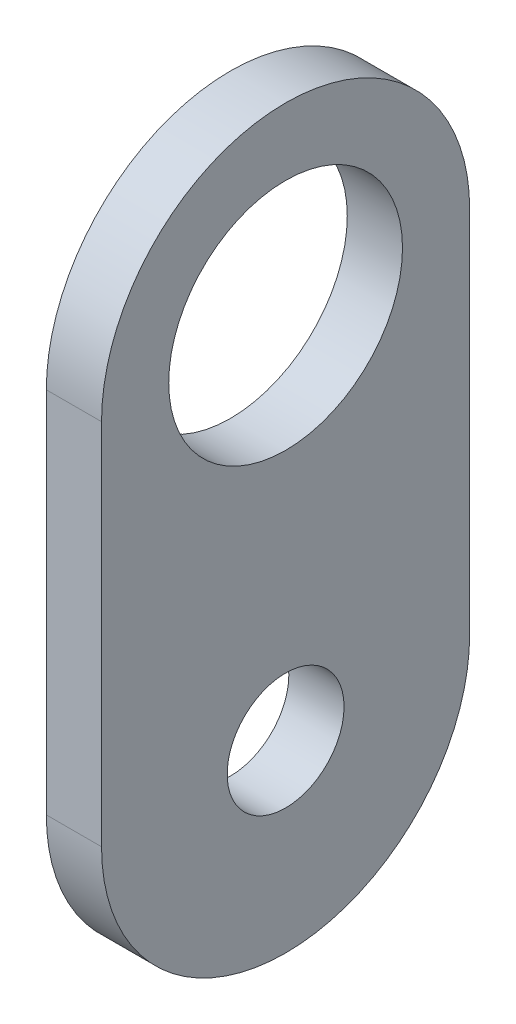
ISO-10303-21;
HEADER;
FILE_DESCRIPTION(('STEP AP214'),'2;1');
FILE_NAME('part.step','',(''),(''),'','','');
FILE_SCHEMA(('AUTOMOTIVE_DESIGN { 1 0 10303 214 1 1 1 1 }'));
ENDSEC;
DATA;
#1=APPLICATION_CONTEXT('core data for automotive mechanical design processes');
#2=APPLICATION_PROTOCOL_DEFINITION('international standard','automotive_design',2000,#1);
#3=PRODUCT_CONTEXT('',#1,'mechanical');
#4=PRODUCT('Part','Part','',(#3));
#5=PRODUCT_RELATED_PRODUCT_CATEGORY('part','',(#4));
#6=PRODUCT_DEFINITION_FORMATION('','',#4);
#7=PRODUCT_DEFINITION_CONTEXT('part definition',#1,'design');
#8=PRODUCT_DEFINITION('design','',#6,#7);
#9=PRODUCT_DEFINITION_SHAPE('','',#8);
#10=(LENGTH_UNIT() NAMED_UNIT(*) SI_UNIT(.MILLI.,.METRE.));
#11=(NAMED_UNIT(*) PLANE_ANGLE_UNIT() SI_UNIT($,.RADIAN.));
#12=(NAMED_UNIT(*) SI_UNIT($,.STERADIAN.) SOLID_ANGLE_UNIT());
#13=UNCERTAINTY_MEASURE_WITH_UNIT(LENGTH_MEASURE(1.E-05),#10,'distance_accuracy_value','');
#14=(GEOMETRIC_REPRESENTATION_CONTEXT(3) GLOBAL_UNCERTAINTY_ASSIGNED_CONTEXT((#13)) GLOBAL_UNIT_ASSIGNED_CONTEXT((#10,
#11,#12)) REPRESENTATION_CONTEXT('',''));
#15=CARTESIAN_POINT('',(0.,0.,0.));
#16=DIRECTION('',(0.,0.,1.));
#17=DIRECTION('',(1.,0.,0.));
#18=AXIS2_PLACEMENT_3D('',#15,#16,#17);
#19=CARTESIAN_POINT('',(0.,9.99999999999999,0.));
#20=DIRECTION('',(-1.,0.,0.));
#21=DIRECTION('',(0.,0.,1.));
#22=AXIS2_PLACEMENT_3D('',#19,#20,#21);
#23=CYLINDRICAL_SURFACE('',#22,10.);
#24=DIRECTION('',(1.,0.,0.));
#25=VECTOR('',#24,1.);
#26=CARTESIAN_POINT('',(0.,9.99999999999999,-10.));
#27=LINE('',#26,#25);
#28=CARTESIAN_POINT('',(0.,9.99999999999999,-10.));
#29=VERTEX_POINT('',#28);
#30=CARTESIAN_POINT('',(3.,9.99999999999999,-10.));
#31=VERTEX_POINT('',#30);
#32=EDGE_CURVE('E92',#29,#31,#27,.T.);
#33=ORIENTED_EDGE('',*,*,#32,.F.);
#34=CARTESIAN_POINT('',(0.,9.99999999999999,0.));
#35=DIRECTION('',(-1.,0.,0.));
#36=DIRECTION('',(0.,0.,1.));
#37=AXIS2_PLACEMENT_3D('',#34,#35,#36);
#38=CIRCLE('',#37,10.);
#39=CARTESIAN_POINT('',(0.,9.99999999999999,10.));
#40=VERTEX_POINT('',#39);
#41=EDGE_CURVE('E49',#40,#29,#38,.T.);
#42=ORIENTED_EDGE('',*,*,#41,.F.);
#43=DIRECTION('',(-1.,0.,0.));
#44=VECTOR('',#43,1.);
#45=CARTESIAN_POINT('',(3.,9.99999999999999,10.));
#46=LINE('',#45,#44);
#47=CARTESIAN_POINT('',(3.,9.99999999999999,10.));
#48=VERTEX_POINT('',#47);
#49=EDGE_CURVE('E130',#48,#40,#46,.T.);
#50=ORIENTED_EDGE('',*,*,#49,.F.);
#51=CARTESIAN_POINT('',(3.,9.99999999999999,0.));
#52=DIRECTION('',(-1.,0.,0.));
#53=DIRECTION('',(0.,0.,1.));
#54=AXIS2_PLACEMENT_3D('',#51,#52,#53);
#55=CIRCLE('',#54,10.);
#56=EDGE_CURVE('E11',#31,#48,#55,.F.);
#57=ORIENTED_EDGE('',*,*,#56,.F.);
#58=EDGE_LOOP('',(#33,#42,#50,#57));
#59=FACE_BOUND('',#58,.T.);
#60=ADVANCED_FACE('F40',(#59),#23,.T.);
#61=CARTESIAN_POINT('',(3.,-10.,0.));
#62=DIRECTION('',(-1.,0.,0.));
#63=DIRECTION('',(0.,0.,1.));
#64=AXIS2_PLACEMENT_3D('',#61,#62,#63);
#65=CYLINDRICAL_SURFACE('',#64,10.);
#66=DIRECTION('',(-1.,0.,0.));
#67=VECTOR('',#66,1.);
#68=CARTESIAN_POINT('',(3.,-10.,-10.));
#69=LINE('',#68,#67);
#70=CARTESIAN_POINT('',(3.,-10.,-10.));
#71=VERTEX_POINT('',#70);
#72=CARTESIAN_POINT('',(0.,-10.,-10.));
#73=VERTEX_POINT('',#72);
#74=EDGE_CURVE('E83',#71,#73,#69,.T.);
#75=ORIENTED_EDGE('',*,*,#74,.F.);
#76=CARTESIAN_POINT('',(3.,-10.,0.));
#77=DIRECTION('',(-1.,0.,0.));
#78=DIRECTION('',(0.,0.,1.));
#79=AXIS2_PLACEMENT_3D('',#76,#77,#78);
#80=CIRCLE('',#79,10.);
#81=CARTESIAN_POINT('',(3.,-10.,10.));
#82=VERTEX_POINT('',#81);
#83=EDGE_CURVE('E93',#82,#71,#80,.F.);
#84=ORIENTED_EDGE('',*,*,#83,.F.);
#85=DIRECTION('',(1.,0.,0.));
#86=VECTOR('',#85,1.);
#87=CARTESIAN_POINT('',(3.,-10.,10.));
#88=LINE('',#87,#86);
#89=CARTESIAN_POINT('',(0.,-10.,10.));
#90=VERTEX_POINT('',#89);
#91=EDGE_CURVE('E86',#90,#82,#88,.T.);
#92=ORIENTED_EDGE('',*,*,#91,.F.);
#93=CARTESIAN_POINT('',(0.,-10.,0.));
#94=DIRECTION('',(-1.,0.,0.));
#95=DIRECTION('',(0.,0.,1.));
#96=AXIS2_PLACEMENT_3D('',#93,#94,#95);
#97=CIRCLE('',#96,10.);
#98=EDGE_CURVE('E80',#73,#90,#97,.T.);
#99=ORIENTED_EDGE('',*,*,#98,.F.);
#100=EDGE_LOOP('',(#75,#84,#92,#99));
#101=FACE_BOUND('',#100,.T.);
#102=ADVANCED_FACE('F82',(#101),#65,.T.);
#103=CARTESIAN_POINT('',(3.,-20.,10.));
#104=DIRECTION('',(0.,0.,1.));
#105=DIRECTION('',(1.,0.,0.));
#106=AXIS2_PLACEMENT_3D('',#103,#104,#105);
#107=PLANE('',#106);
#108=DIRECTION('',(0.,1.,0.));
#109=VECTOR('',#108,1.);
#110=CARTESIAN_POINT('',(3.,-20.,10.));
#111=LINE('',#110,#109);
#112=EDGE_CURVE('E105',#82,#48,#111,.T.);
#113=ORIENTED_EDGE('',*,*,#112,.T.);
#114=ORIENTED_EDGE('',*,*,#49,.T.);
#115=DIRECTION('',(0.,1.,0.));
#116=VECTOR('',#115,1.);
#117=CARTESIAN_POINT('',(0.,-20.,10.));
#118=LINE('',#117,#116);
#119=EDGE_CURVE('E106',#90,#40,#118,.T.);
#120=ORIENTED_EDGE('',*,*,#119,.F.);
#121=ORIENTED_EDGE('',*,*,#91,.T.);
#122=EDGE_LOOP('',(#113,#114,#120,#121));
#123=FACE_BOUND('',#122,.T.);
#124=ADVANCED_FACE('F168',(#123),#107,.T.);
#125=CARTESIAN_POINT('',(3.,-20.,-10.));
#126=DIRECTION('',(0.,0.,1.));
#127=DIRECTION('',(1.,0.,0.));
#128=AXIS2_PLACEMENT_3D('',#125,#126,#127);
#129=PLANE('',#128);
#130=DIRECTION('',(0.,1.,0.));
#131=VECTOR('',#130,1.);
#132=CARTESIAN_POINT('',(0.,-20.,-10.));
#133=LINE('',#132,#131);
#134=EDGE_CURVE('E99',#73,#29,#133,.T.);
#135=ORIENTED_EDGE('',*,*,#134,.T.);
#136=ORIENTED_EDGE('',*,*,#32,.T.);
#137=DIRECTION('',(0.,1.,0.));
#138=VECTOR('',#137,1.);
#139=CARTESIAN_POINT('',(3.,-20.,-10.));
#140=LINE('',#139,#138);
#141=EDGE_CURVE('E100',#71,#31,#140,.T.);
#142=ORIENTED_EDGE('',*,*,#141,.F.);
#143=ORIENTED_EDGE('',*,*,#74,.T.);
#144=EDGE_LOOP('',(#135,#136,#142,#143));
#145=FACE_BOUND('',#144,.T.);
#146=ADVANCED_FACE('F97',(#145),#129,.F.);
#147=CARTESIAN_POINT('',(3.,0.,0.));
#148=DIRECTION('',(-1.,0.,0.));
#149=DIRECTION('',(0.,0.,1.));
#150=AXIS2_PLACEMENT_3D('',#147,#148,#149);
#151=PLANE('',#150);
#152=CARTESIAN_POINT('',(3.,10.,0.));
#153=DIRECTION('',(1.,0.,0.));
#154=DIRECTION('',(0.,0.,-1.));
#155=AXIS2_PLACEMENT_3D('',#152,#153,#154);
#156=CIRCLE('',#155,6.35);
#157=CARTESIAN_POINT('',(3.,10.,-6.35));
#158=VERTEX_POINT('',#157);
#159=EDGE_CURVE('E120',#158,#158,#156,.T.);
#160=ORIENTED_EDGE('',*,*,#159,.F.);
#161=EDGE_LOOP('',(#160));
#162=FACE_BOUND('',#161,.T.);
#163=CARTESIAN_POINT('',(3.,-10.,0.));
#164=DIRECTION('',(1.,0.,0.));
#165=DIRECTION('',(0.,0.,-1.));
#166=AXIS2_PLACEMENT_3D('',#163,#164,#165);
#167=CIRCLE('',#166,3.175);
#168=CARTESIAN_POINT('',(3.,-10.,-3.175));
#169=VERTEX_POINT('',#168);
#170=EDGE_CURVE('E135',#169,#169,#167,.T.);
#171=ORIENTED_EDGE('',*,*,#170,.F.);
#172=EDGE_LOOP('',(#171));
#173=FACE_BOUND('',#172,.T.);
#174=ORIENTED_EDGE('',*,*,#141,.T.);
#175=ORIENTED_EDGE('',*,*,#56,.T.);
#176=ORIENTED_EDGE('',*,*,#112,.F.);
#177=ORIENTED_EDGE('',*,*,#83,.T.);
#178=EDGE_LOOP('',(#174,#175,#176,#177));
#179=FACE_BOUND('',#178,.T.);
#180=ADVANCED_FACE('F145',(#162,#173,#179),#151,.F.);
#181=CARTESIAN_POINT('',(0.,0.,0.));
#182=DIRECTION('',(-1.,0.,0.));
#183=DIRECTION('',(0.,0.,1.));
#184=AXIS2_PLACEMENT_3D('',#181,#182,#183);
#185=PLANE('',#184);
#186=CARTESIAN_POINT('',(0.,10.,0.));
#187=DIRECTION('',(-1.,0.,0.));
#188=DIRECTION('',(0.,0.,1.));
#189=AXIS2_PLACEMENT_3D('',#186,#187,#188);
#190=CIRCLE('',#189,6.35);
#191=CARTESIAN_POINT('',(0.,10.,6.35));
#192=VERTEX_POINT('',#191);
#193=EDGE_CURVE('E112',#192,#192,#190,.T.);
#194=ORIENTED_EDGE('',*,*,#193,.F.);
#195=EDGE_LOOP('',(#194));
#196=FACE_BOUND('',#195,.T.);
#197=CARTESIAN_POINT('',(0.,-10.,0.));
#198=DIRECTION('',(-1.,0.,0.));
#199=DIRECTION('',(0.,0.,1.));
#200=AXIS2_PLACEMENT_3D('',#197,#198,#199);
#201=CIRCLE('',#200,3.175);
#202=CARTESIAN_POINT('',(0.,-10.,3.175));
#203=VERTEX_POINT('',#202);
#204=EDGE_CURVE('E116',#203,#203,#201,.T.);
#205=ORIENTED_EDGE('',*,*,#204,.F.);
#206=EDGE_LOOP('',(#205));
#207=FACE_BOUND('',#206,.T.);
#208=ORIENTED_EDGE('',*,*,#119,.T.);
#209=ORIENTED_EDGE('',*,*,#41,.T.);
#210=ORIENTED_EDGE('',*,*,#134,.F.);
#211=ORIENTED_EDGE('',*,*,#98,.T.);
#212=EDGE_LOOP('',(#208,#209,#210,#211));
#213=FACE_BOUND('',#212,.T.);
#214=ADVANCED_FACE('F103',(#196,#207,#213),#185,.T.);
#215=CARTESIAN_POINT('',(-2.,-10.,0.));
#216=DIRECTION('',(1.,0.,0.));
#217=DIRECTION('',(0.,0.,-1.));
#218=AXIS2_PLACEMENT_3D('',#215,#216,#217);
#219=CYLINDRICAL_SURFACE('',#218,3.175);
#220=ORIENTED_EDGE('',*,*,#204,.T.);
#221=EDGE_LOOP('',(#220));
#222=FACE_BOUND('',#221,.T.);
#223=ORIENTED_EDGE('',*,*,#170,.T.);
#224=EDGE_LOOP('',(#223));
#225=FACE_BOUND('',#224,.T.);
#226=ADVANCED_FACE('F151',(#222,#225),#219,.F.);
#227=CARTESIAN_POINT('',(-2.,10.,0.));
#228=DIRECTION('',(1.,0.,0.));
#229=DIRECTION('',(0.,0.,-1.));
#230=AXIS2_PLACEMENT_3D('',#227,#228,#229);
#231=CYLINDRICAL_SURFACE('',#230,6.35);
#232=ORIENTED_EDGE('',*,*,#193,.T.);
#233=EDGE_LOOP('',(#232));
#234=FACE_BOUND('',#233,.T.);
#235=ORIENTED_EDGE('',*,*,#159,.T.);
#236=EDGE_LOOP('',(#235));
#237=FACE_BOUND('',#236,.T.);
#238=ADVANCED_FACE('F143',(#234,#237),#231,.F.);
#239=CLOSED_SHELL('',(#60,#102,#124,#146,#180,#214,#226,#238));
#240=MANIFOLD_SOLID_BREP('B2',#239);
#241=ADVANCED_BREP_SHAPE_REPRESENTATION('',(#18,#240),#14);
#242=SHAPE_DEFINITION_REPRESENTATION(#9,#241);
ENDSEC;
END-ISO-10303-21;
